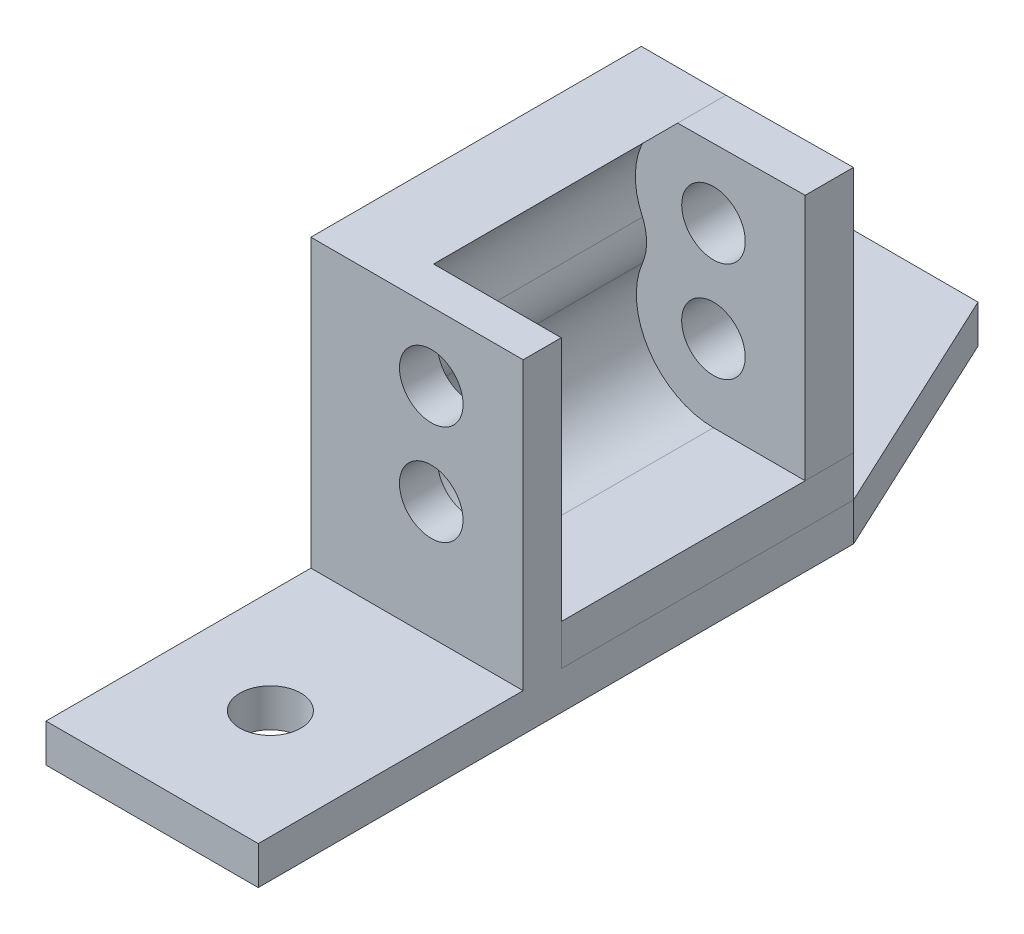
ISO-10303-21;
HEADER;
FILE_DESCRIPTION(('STEP AP214'),'2;1');
FILE_NAME('part.step','',(''),(''),'','','');
FILE_SCHEMA(('AUTOMOTIVE_DESIGN { 1 0 10303 214 1 1 1 1 }'));
ENDSEC;
DATA;
#1=APPLICATION_CONTEXT('core data for automotive mechanical design processes');
#2=APPLICATION_PROTOCOL_DEFINITION('international standard','automotive_design',2000,#1);
#3=PRODUCT_CONTEXT('',#1,'mechanical');
#4=PRODUCT('Part','Part','',(#3));
#5=PRODUCT_RELATED_PRODUCT_CATEGORY('part','',(#4));
#6=PRODUCT_DEFINITION_FORMATION('','',#4);
#7=PRODUCT_DEFINITION_CONTEXT('part definition',#1,'design');
#8=PRODUCT_DEFINITION('design','',#6,#7);
#9=PRODUCT_DEFINITION_SHAPE('','',#8);
#10=(LENGTH_UNIT() NAMED_UNIT(*) SI_UNIT(.MILLI.,.METRE.));
#11=(NAMED_UNIT(*) PLANE_ANGLE_UNIT() SI_UNIT($,.RADIAN.));
#12=(NAMED_UNIT(*) SI_UNIT($,.STERADIAN.) SOLID_ANGLE_UNIT());
#13=UNCERTAINTY_MEASURE_WITH_UNIT(LENGTH_MEASURE(1.E-05),#10,'distance_accuracy_value','');
#14=(GEOMETRIC_REPRESENTATION_CONTEXT(3) GLOBAL_UNCERTAINTY_ASSIGNED_CONTEXT((#13)) GLOBAL_UNIT_ASSIGNED_CONTEXT((#10,
#11,#12)) REPRESENTATION_CONTEXT('',''));
#15=CARTESIAN_POINT('',(0.,0.,0.));
#16=DIRECTION('',(0.,0.,1.));
#17=DIRECTION('',(1.,0.,0.));
#18=AXIS2_PLACEMENT_3D('',#15,#16,#17);
#19=CARTESIAN_POINT('',(103.654945314713,124.177430344163,-29.21));
#20=DIRECTION('',(0.,0.,1.));
#21=DIRECTION('',(1.,0.,0.));
#22=AXIS2_PLACEMENT_3D('',#19,#20,#21);
#23=CYLINDRICAL_SURFACE('',#22,7.41206888535351);
#24=DIRECTION('',(0.,0.,1.));
#25=VECTOR('',#24,1.);
#26=CARTESIAN_POINT('',(96.9626522694184,120.991213314968,-29.21));
#27=LINE('',#26,#25);
#28=CARTESIAN_POINT('',(96.9626522694184,120.991213314968,-24.384));
#29=VERTEX_POINT('',#28);
#30=CARTESIAN_POINT('',(96.9626522694184,120.991213314968,0.));
#31=VERTEX_POINT('',#30);
#32=EDGE_CURVE('E11',#29,#31,#27,.T.);
#33=ORIENTED_EDGE('',*,*,#32,.F.);
#34=CARTESIAN_POINT('',(103.654945314713,124.177430344163,-24.384));
#35=DIRECTION('',(0.,0.,-1.));
#36=DIRECTION('',(1.,0.,0.));
#37=AXIS2_PLACEMENT_3D('',#34,#35,#36);
#38=CIRCLE('',#37,7.41206888535352);
#39=CARTESIAN_POINT('',(100.468728285518,130.869723389457,-24.384));
#40=VERTEX_POINT('',#39);
#41=EDGE_CURVE('E246',#29,#40,#38,.T.);
#42=ORIENTED_EDGE('',*,*,#41,.T.);
#43=DIRECTION('',(0.,0.,1.));
#44=VECTOR('',#43,1.);
#45=CARTESIAN_POINT('',(100.468728285518,130.869723389457,-29.21));
#46=LINE('',#45,#44);
#47=CARTESIAN_POINT('',(100.468728285518,130.869723389457,0.));
#48=VERTEX_POINT('',#47);
#49=EDGE_CURVE('E301',#40,#48,#46,.T.);
#50=ORIENTED_EDGE('',*,*,#49,.T.);
#51=CARTESIAN_POINT('',(103.654945314713,124.177430344163,0.));
#52=DIRECTION('',(0.,0.,1.));
#53=DIRECTION('',(1.,0.,0.));
#54=AXIS2_PLACEMENT_3D('',#51,#52,#53);
#55=CIRCLE('',#54,7.41206888535351);
#56=EDGE_CURVE('E289',#48,#31,#55,.T.);
#57=ORIENTED_EDGE('',*,*,#56,.T.);
#58=EDGE_LOOP('',(#33,#42,#50,#57));
#59=FACE_BOUND('',#58,.T.);
#60=ADVANCED_FACE('F47',(#59),#23,.F.);
#61=CARTESIAN_POINT('',(92.2865318082464,119.006195070062,-29.21));
#62=DIRECTION('',(0.,0.,1.));
#63=DIRECTION('',(1.,0.,0.));
#64=AXIS2_PLACEMENT_3D('',#61,#62,#63);
#65=CYLINDRICAL_SURFACE('',#64,5.0800000000001);
#66=CARTESIAN_POINT('',(92.2865318082464,119.006195070062,-24.384));
#67=DIRECTION('',(0.,0.,1.));
#68=DIRECTION('',(-1.,0.,0.));
#69=AXIS2_PLACEMENT_3D('',#66,#67,#68);
#70=CIRCLE('',#69,5.08000000000009);
#71=CARTESIAN_POINT('',(96.960558708895,117.016252223643,-24.384));
#72=VERTEX_POINT('',#71);
#73=EDGE_CURVE('E62',#72,#29,#70,.T.);
#74=ORIENTED_EDGE('',*,*,#73,.T.);
#75=ORIENTED_EDGE('',*,*,#32,.T.);
#76=CARTESIAN_POINT('',(92.2865318082464,119.006195070062,0.));
#77=DIRECTION('',(0.,0.,1.));
#78=DIRECTION('',(1.,0.,0.));
#79=AXIS2_PLACEMENT_3D('',#76,#77,#78);
#80=CIRCLE('',#79,5.0800000000001);
#81=CARTESIAN_POINT('',(96.960558708895,117.016252223643,0.));
#82=VERTEX_POINT('',#81);
#83=EDGE_CURVE('E294',#82,#31,#80,.T.);
#84=ORIENTED_EDGE('',*,*,#83,.F.);
#85=DIRECTION('',(0.,0.,1.));
#86=VECTOR('',#85,1.);
#87=CARTESIAN_POINT('',(96.960558708895,117.016252223643,-29.21));
#88=LINE('',#87,#86);
#89=EDGE_CURVE('E55',#72,#82,#88,.T.);
#90=ORIENTED_EDGE('',*,*,#89,.F.);
#91=EDGE_LOOP('',(#74,#75,#84,#90));
#92=FACE_BOUND('',#91,.T.);
#93=ADVANCED_FACE('F356',(#92),#65,.T.);
#94=CARTESIAN_POINT('',(104.045206420171,113.999999999999,-29.21));
#95=DIRECTION('',(0.,0.,1.));
#96=DIRECTION('',(1.,0.,0.));
#97=AXIS2_PLACEMENT_3D('',#94,#95,#96);
#98=CYLINDRICAL_SURFACE('',#97,7.70000069282641);
#99=CARTESIAN_POINT('',(104.045206420171,113.999999999999,-24.384));
#100=DIRECTION('',(0.,0.,-1.));
#101=DIRECTION('',(1.,0.,0.));
#102=AXIS2_PLACEMENT_3D('',#99,#100,#101);
#103=CIRCLE('',#102,7.70000069282641);
#104=CARTESIAN_POINT('',(104.041152893911,106.300000374126,-24.384));
#105=VERTEX_POINT('',#104);
#106=EDGE_CURVE('E70',#105,#72,#103,.T.);
#107=ORIENTED_EDGE('',*,*,#106,.T.);
#108=ORIENTED_EDGE('',*,*,#89,.T.);
#109=CARTESIAN_POINT('',(104.045206420171,113.999999999999,0.));
#110=DIRECTION('',(0.,0.,1.));
#111=DIRECTION('',(1.,0.,0.));
#112=AXIS2_PLACEMENT_3D('',#109,#110,#111);
#113=CIRCLE('',#112,7.70000069282641);
#114=CARTESIAN_POINT('',(104.041152893911,106.300000374126,0.));
#115=VERTEX_POINT('',#114);
#116=EDGE_CURVE('E310',#115,#82,#113,.F.);
#117=ORIENTED_EDGE('',*,*,#116,.F.);
#118=DIRECTION('',(0.,0.,1.));
#119=VECTOR('',#118,1.);
#120=CARTESIAN_POINT('',(104.041152893911,106.300000374126,-29.21));
#121=LINE('',#120,#119);
#122=EDGE_CURVE('E316',#105,#115,#121,.T.);
#123=ORIENTED_EDGE('',*,*,#122,.F.);
#124=EDGE_LOOP('',(#107,#108,#117,#123));
#125=FACE_BOUND('',#124,.T.);
#126=ADVANCED_FACE('F355',(#125),#98,.F.);
#127=CARTESIAN_POINT('',(0.0559885400642075,106.35474149294,-29.21));
#128=DIRECTION('',(-0.000526431934488368,-0.9999998614347,0.));
#129=DIRECTION('',(0.9999998614347,-0.000526431934488368,0.));
#130=AXIS2_PLACEMENT_3D('',#127,#128,#129);
#131=PLANE('',#130);
#132=DIRECTION('',(0.,0.,1.));
#133=VECTOR('',#132,1.);
#134=CARTESIAN_POINT('',(113.21029867799,106.295173442304,-29.21));
#135=LINE('',#134,#133);
#136=CARTESIAN_POINT('',(113.21029867799,106.295173442304,-24.384));
#137=VERTEX_POINT('',#136);
#138=CARTESIAN_POINT('',(113.21029867799,106.295173442304,0.));
#139=VERTEX_POINT('',#138);
#140=EDGE_CURVE('E321',#137,#139,#135,.T.);
#141=ORIENTED_EDGE('',*,*,#140,.F.);
#142=DIRECTION('',(-0.9999998614347,0.000526431934489882,0.));
#143=VECTOR('',#142,1.);
#144=CARTESIAN_POINT('',(104.041152893911,106.300000374126,-24.384));
#145=LINE('',#144,#143);
#146=EDGE_CURVE('E241',#137,#105,#145,.T.);
#147=ORIENTED_EDGE('',*,*,#146,.T.);
#148=ORIENTED_EDGE('',*,*,#122,.T.);
#149=DIRECTION('',(0.9999998614347,-0.000526431934488368,0.));
#150=VECTOR('',#149,1.);
#151=CARTESIAN_POINT('',(0.0559885400642075,106.35474149294,0.));
#152=LINE('',#151,#150);
#153=EDGE_CURVE('E307',#115,#139,#152,.T.);
#154=ORIENTED_EDGE('',*,*,#153,.T.);
#155=EDGE_LOOP('',(#141,#147,#148,#154));
#156=FACE_BOUND('',#155,.T.);
#157=ADVANCED_FACE('F353',(#156),#131,.F.);
#158=CARTESIAN_POINT('',(113.59123961095,0.408659717572379,-29.21));
#159=DIRECTION('',(0.999993528577245,0.00359761082247394,0.));
#160=DIRECTION('',(-0.00359761082247394,0.999993528577246,0.));
#161=AXIS2_PLACEMENT_3D('',#158,#159,#160);
#162=PLANE('',#161);
#163=DIRECTION('',(-0.00359761082247394,0.999993528577245,0.));
#164=VECTOR('',#163,1.);
#165=CARTESIAN_POINT('',(113.59123961095,0.408659717572379,0.));
#166=LINE('',#165,#164);
#167=CARTESIAN_POINT('',(113.224902097455,102.236000374126,0.));
#168=VERTEX_POINT('',#167);
#169=EDGE_CURVE('E304',#168,#139,#166,.T.);
#170=ORIENTED_EDGE('',*,*,#169,.F.);
#171=DIRECTION('',(0.,0.,1.));
#172=VECTOR('',#171,1.);
#173=CARTESIAN_POINT('',(113.224902097455,102.236000374126,-29.21));
#174=LINE('',#173,#172);
#175=CARTESIAN_POINT('',(113.224902097455,102.236000374126,-29.21));
#176=VERTEX_POINT('',#175);
#177=EDGE_CURVE('E322',#176,#168,#174,.T.);
#178=ORIENTED_EDGE('',*,*,#177,.F.);
#179=DIRECTION('',(-0.00359761082247394,0.999993528577245,0.));
#180=VECTOR('',#179,1.);
#181=CARTESIAN_POINT('',(113.59123961095,0.408659717572379,-29.21));
#182=LINE('',#181,#180);
#183=CARTESIAN_POINT('',(113.21029867799,106.295173442304,-29.21));
#184=VERTEX_POINT('',#183);
#185=EDGE_CURVE('E299',#176,#184,#182,.T.);
#186=ORIENTED_EDGE('',*,*,#185,.T.);
#187=EDGE_CURVE('E318',#184,#137,#135,.T.);
#188=ORIENTED_EDGE('',*,*,#187,.T.);
#189=ORIENTED_EDGE('',*,*,#140,.T.);
#190=EDGE_LOOP('',(#170,#178,#186,#188,#189));
#191=FACE_BOUND('',#190,.T.);
#192=ADVANCED_FACE('F349',(#191),#162,.T.);
#193=CARTESIAN_POINT('',(92.0179779446539,0.,-29.21));
#194=DIRECTION('',(-1.,0.,0.));
#195=DIRECTION('',(0.,0.,1.));
#196=AXIS2_PLACEMENT_3D('',#193,#194,#195);
#197=PLANE('',#196);
#198=DIRECTION('',(0.,-1.,0.));
#199=VECTOR('',#198,1.);
#200=CARTESIAN_POINT('',(92.0179779446539,0.,-29.21));
#201=LINE('',#200,#199);
#202=CARTESIAN_POINT('',(92.0179779446539,130.869723389457,-29.21));
#203=VERTEX_POINT('',#202);
#204=CARTESIAN_POINT('',(92.0179779446539,102.236000374126,-29.21));
#205=VERTEX_POINT('',#204);
#206=EDGE_CURVE('E293',#203,#205,#201,.T.);
#207=ORIENTED_EDGE('',*,*,#206,.T.);
#208=DIRECTION('',(0.,1.,0.));
#209=VECTOR('',#208,1.);
#210=CARTESIAN_POINT('',(92.0179779446539,98.4260003741257,-29.21));
#211=LINE('',#210,#209);
#212=CARTESIAN_POINT('',(92.0179779446539,98.4260003741257,-29.21));
#213=VERTEX_POINT('',#212);
#214=EDGE_CURVE('E172',#213,#205,#211,.T.);
#215=ORIENTED_EDGE('',*,*,#214,.F.);
#216=DIRECTION('',(0.,0.,1.));
#217=VECTOR('',#216,1.);
#218=CARTESIAN_POINT('',(92.0179779446539,98.4260003741257,-29.21));
#219=LINE('',#218,#217);
#220=CARTESIAN_POINT('',(92.0179779446539,98.4260003741257,30.2731574693667));
#221=VERTEX_POINT('',#220);
#222=EDGE_CURVE('E164',#213,#221,#219,.T.);
#223=ORIENTED_EDGE('',*,*,#222,.T.);
#224=DIRECTION('',(0.,1.,0.));
#225=VECTOR('',#224,1.);
#226=CARTESIAN_POINT('',(92.0179779446539,98.4260003741257,30.2731574693667));
#227=LINE('',#226,#225);
#228=CARTESIAN_POINT('',(92.0179779446539,102.236000374126,30.2731574693667));
#229=VERTEX_POINT('',#228);
#230=EDGE_CURVE('E169',#221,#229,#227,.T.);
#231=ORIENTED_EDGE('',*,*,#230,.T.);
#232=DIRECTION('',(0.,0.,1.));
#233=VECTOR('',#232,1.);
#234=CARTESIAN_POINT('',(92.0179779446539,102.236000374126,3.81));
#235=LINE('',#234,#233);
#236=CARTESIAN_POINT('',(92.0179779446539,102.236000374126,3.81));
#237=VERTEX_POINT('',#236);
#238=EDGE_CURVE('E204',#237,#229,#235,.T.);
#239=ORIENTED_EDGE('',*,*,#238,.F.);
#240=DIRECTION('',(0.,-1.,0.));
#241=VECTOR('',#240,1.);
#242=CARTESIAN_POINT('',(92.0179779446539,130.869723389457,3.81));
#243=LINE('',#242,#241);
#244=CARTESIAN_POINT('',(92.0179779446539,130.869723389457,3.81));
#245=VERTEX_POINT('',#244);
#246=EDGE_CURVE('E276',#245,#237,#243,.T.);
#247=ORIENTED_EDGE('',*,*,#246,.F.);
#248=DIRECTION('',(0.,0.,1.));
#249=VECTOR('',#248,1.);
#250=CARTESIAN_POINT('',(92.0179779446539,130.869723389457,-29.21));
#251=LINE('',#250,#249);
#252=EDGE_CURVE('E324',#203,#245,#251,.T.);
#253=ORIENTED_EDGE('',*,*,#252,.F.);
#254=EDGE_LOOP('',(#207,#215,#223,#231,#239,#247,#253));
#255=FACE_BOUND('',#254,.T.);
#256=ADVANCED_FACE('F167',(#255),#197,.T.);
#257=CARTESIAN_POINT('',(0.,130.869723389457,-29.21));
#258=DIRECTION('',(0.,1.,0.));
#259=DIRECTION('',(0.,0.,1.));
#260=AXIS2_PLACEMENT_3D('',#257,#258,#259);
#261=PLANE('',#260);
#262=ORIENTED_EDGE('',*,*,#252,.T.);
#263=DIRECTION('',(-1.,0.,0.));
#264=VECTOR('',#263,1.);
#265=CARTESIAN_POINT('',(92.0179779446539,130.869723389457,3.81));
#266=LINE('',#265,#264);
#267=CARTESIAN_POINT('',(113.224902097455,130.869723389457,3.81));
#268=VERTEX_POINT('',#267);
#269=EDGE_CURVE('E273',#268,#245,#266,.T.);
#270=ORIENTED_EDGE('',*,*,#269,.F.);
#271=DIRECTION('',(0.,0.,-1.));
#272=VECTOR('',#271,1.);
#273=CARTESIAN_POINT('',(113.224902097455,130.869723389457,3.81));
#274=LINE('',#273,#272);
#275=CARTESIAN_POINT('',(113.224902097455,130.869723389457,0.));
#276=VERTEX_POINT('',#275);
#277=EDGE_CURVE('E283',#268,#276,#274,.T.);
#278=ORIENTED_EDGE('',*,*,#277,.T.);
#279=DIRECTION('',(-1.,0.,0.));
#280=VECTOR('',#279,1.);
#281=CARTESIAN_POINT('',(92.0179779446539,130.869723389457,0.));
#282=LINE('',#281,#280);
#283=EDGE_CURVE('E270',#276,#48,#282,.T.);
#284=ORIENTED_EDGE('',*,*,#283,.T.);
#285=ORIENTED_EDGE('',*,*,#49,.F.);
#286=CARTESIAN_POINT('',(100.468728285518,130.869723389457,-29.21));
#287=VERTEX_POINT('',#286);
#288=EDGE_CURVE('E50',#287,#40,#46,.T.);
#289=ORIENTED_EDGE('',*,*,#288,.F.);
#290=DIRECTION('',(-1.,0.,0.));
#291=VECTOR('',#290,1.);
#292=CARTESIAN_POINT('',(0.,130.869723389457,-29.21));
#293=LINE('',#292,#291);
#294=EDGE_CURVE('E290',#287,#203,#293,.T.);
#295=ORIENTED_EDGE('',*,*,#294,.T.);
#296=EDGE_LOOP('',(#262,#270,#278,#284,#285,#289,#295));
#297=FACE_BOUND('',#296,.T.);
#298=ADVANCED_FACE('F341',(#297),#261,.T.);
#299=CARTESIAN_POINT('',(0.,0.,-29.21));
#300=DIRECTION('',(0.,0.,1.));
#301=DIRECTION('',(1.,0.,0.));
#302=AXIS2_PLACEMENT_3D('',#299,#300,#301);
#303=PLANE('',#302);
#304=DIRECTION('',(0.,-1.,0.));
#305=VECTOR('',#304,1.);
#306=CARTESIAN_POINT('',(113.21029867799,106.295173442304,-29.21));
#307=LINE('',#306,#305);
#308=CARTESIAN_POINT('',(113.21029867799,130.994991710537,-29.21));
#309=VERTEX_POINT('',#308);
#310=EDGE_CURVE('E243',#309,#184,#307,.T.);
#311=ORIENTED_EDGE('',*,*,#310,.T.);
#312=ORIENTED_EDGE('',*,*,#185,.F.);
#313=DIRECTION('',(1.,0.,0.));
#314=VECTOR('',#313,1.);
#315=CARTESIAN_POINT('',(0.,102.236000374126,-29.21));
#316=LINE('',#315,#314);
#317=EDGE_CURVE('E296',#205,#176,#316,.T.);
#318=ORIENTED_EDGE('',*,*,#317,.F.);
#319=ORIENTED_EDGE('',*,*,#206,.F.);
#320=ORIENTED_EDGE('',*,*,#294,.F.);
#321=DIRECTION('',(0.99995167463754,0.00983099128164452,0.));
#322=VECTOR('',#321,1.);
#323=CARTESIAN_POINT('',(113.21029867799,130.994991710537,-29.21));
#324=LINE('',#323,#322);
#325=EDGE_CURVE('E238',#287,#309,#324,.T.);
#326=ORIENTED_EDGE('',*,*,#325,.T.);
#327=EDGE_LOOP('',(#311,#312,#318,#319,#320,#326));
#328=FACE_BOUND('',#327,.T.);
#329=CARTESIAN_POINT('',(104.050470740246,123.999999999999,-29.21));
#330=DIRECTION('',(0.,0.,-1.));
#331=DIRECTION('',(-1.,0.,0.));
#332=AXIS2_PLACEMENT_3D('',#329,#330,#331);
#333=CIRCLE('',#332,3.17499999999997);
#334=CARTESIAN_POINT('',(100.875470740246,123.999999999999,-29.21));
#335=VERTEX_POINT('',#334);
#336=EDGE_CURVE('E220',#335,#335,#333,.T.);
#337=ORIENTED_EDGE('',*,*,#336,.F.);
#338=EDGE_LOOP('',(#337));
#339=FACE_BOUND('',#338,.T.);
#340=CARTESIAN_POINT('',(104.045206420171,113.999999999999,-29.21));
#341=DIRECTION('',(0.,0.,-1.));
#342=DIRECTION('',(-1.,0.,0.));
#343=AXIS2_PLACEMENT_3D('',#340,#341,#342);
#344=CIRCLE('',#343,3.17499999999994);
#345=CARTESIAN_POINT('',(100.870206420171,113.999999999999,-29.21));
#346=VERTEX_POINT('',#345);
#347=EDGE_CURVE('E232',#346,#346,#344,.T.);
#348=ORIENTED_EDGE('',*,*,#347,.F.);
#349=EDGE_LOOP('',(#348));
#350=FACE_BOUND('',#349,.T.);
#351=ADVANCED_FACE('F365',(#328,#339,#350),#303,.F.);
#352=CARTESIAN_POINT('',(0.,0.,0.));
#353=DIRECTION('',(0.,0.,-1.));
#354=DIRECTION('',(-1.,0.,0.));
#355=AXIS2_PLACEMENT_3D('',#352,#353,#354);
#356=PLANE('',#355);
#357=CARTESIAN_POINT('',(104.045206420171,113.999999999999,0.));
#358=DIRECTION('',(0.,0.,1.));
#359=DIRECTION('',(1.,0.,0.));
#360=AXIS2_PLACEMENT_3D('',#357,#358,#359);
#361=CIRCLE('',#360,3.17500000000001);
#362=CARTESIAN_POINT('',(100.870206420171,113.999999999999,0.));
#363=VERTEX_POINT('',#362);
#364=EDGE_CURVE('E260',#363,#363,#361,.T.);
#365=ORIENTED_EDGE('',*,*,#364,.T.);
#366=EDGE_LOOP('',(#365));
#367=FACE_BOUND('',#366,.T.);
#368=CARTESIAN_POINT('',(104.050470740245,123.999999999999,0.));
#369=DIRECTION('',(0.,0.,1.));
#370=DIRECTION('',(1.,0.,0.));
#371=AXIS2_PLACEMENT_3D('',#368,#369,#370);
#372=CIRCLE('',#371,3.17500000000003);
#373=CARTESIAN_POINT('',(100.875470740245,123.999999999999,0.));
#374=VERTEX_POINT('',#373);
#375=EDGE_CURVE('E264',#374,#374,#372,.T.);
#376=ORIENTED_EDGE('',*,*,#375,.T.);
#377=EDGE_LOOP('',(#376));
#378=FACE_BOUND('',#377,.T.);
#379=ORIENTED_EDGE('',*,*,#56,.F.);
#380=ORIENTED_EDGE('',*,*,#283,.F.);
#381=DIRECTION('',(0.,1.,0.));
#382=VECTOR('',#381,1.);
#383=CARTESIAN_POINT('',(113.224902097455,130.869723389457,0.));
#384=LINE('',#383,#382);
#385=EDGE_CURVE('E277',#168,#276,#384,.T.);
#386=ORIENTED_EDGE('',*,*,#385,.F.);
#387=ORIENTED_EDGE('',*,*,#169,.T.);
#388=ORIENTED_EDGE('',*,*,#153,.F.);
#389=ORIENTED_EDGE('',*,*,#116,.T.);
#390=ORIENTED_EDGE('',*,*,#83,.T.);
#391=EDGE_LOOP('',(#379,#380,#386,#387,#388,#389,#390));
#392=FACE_BOUND('',#391,.T.);
#393=ADVANCED_FACE('F338',(#367,#378,#392),#356,.T.);
#394=CARTESIAN_POINT('',(0.,0.,3.81));
#395=DIRECTION('',(0.,0.,-1.));
#396=DIRECTION('',(-1.,0.,0.));
#397=AXIS2_PLACEMENT_3D('',#394,#395,#396);
#398=PLANE('',#397);
#399=ORIENTED_EDGE('',*,*,#269,.T.);
#400=ORIENTED_EDGE('',*,*,#246,.T.);
#401=DIRECTION('',(1.,0.,0.));
#402=VECTOR('',#401,1.);
#403=CARTESIAN_POINT('',(92.0179779446539,102.236000374126,3.81));
#404=LINE('',#403,#402);
#405=CARTESIAN_POINT('',(113.224902097455,102.236000374126,3.81));
#406=VERTEX_POINT('',#405);
#407=EDGE_CURVE('E279',#237,#406,#404,.T.);
#408=ORIENTED_EDGE('',*,*,#407,.T.);
#409=DIRECTION('',(0.,1.,0.));
#410=VECTOR('',#409,1.);
#411=CARTESIAN_POINT('',(113.224902097455,130.869723389457,3.81));
#412=LINE('',#411,#410);
#413=EDGE_CURVE('E281',#406,#268,#412,.T.);
#414=ORIENTED_EDGE('',*,*,#413,.T.);
#415=EDGE_LOOP('',(#399,#400,#408,#414));
#416=FACE_BOUND('',#415,.T.);
#417=CARTESIAN_POINT('',(104.050470740245,123.999999999999,3.81));
#418=DIRECTION('',(0.,0.,1.));
#419=DIRECTION('',(1.,0.,0.));
#420=AXIS2_PLACEMENT_3D('',#417,#418,#419);
#421=CIRCLE('',#420,3.17500000000003);
#422=CARTESIAN_POINT('',(100.875470740245,123.999999999999,3.81));
#423=VERTEX_POINT('',#422);
#424=EDGE_CURVE('E267',#423,#423,#421,.T.);
#425=ORIENTED_EDGE('',*,*,#424,.F.);
#426=EDGE_LOOP('',(#425));
#427=FACE_BOUND('',#426,.T.);
#428=CARTESIAN_POINT('',(104.045206420171,113.999999999999,3.81));
#429=DIRECTION('',(0.,0.,1.));
#430=DIRECTION('',(1.,0.,0.));
#431=AXIS2_PLACEMENT_3D('',#428,#429,#430);
#432=CIRCLE('',#431,3.17500000000001);
#433=CARTESIAN_POINT('',(100.870206420171,113.999999999999,3.81));
#434=VERTEX_POINT('',#433);
#435=EDGE_CURVE('E261',#434,#434,#432,.T.);
#436=ORIENTED_EDGE('',*,*,#435,.F.);
#437=EDGE_LOOP('',(#436));
#438=FACE_BOUND('',#437,.T.);
#439=ADVANCED_FACE('F405',(#416,#427,#438),#398,.F.);
#440=CARTESIAN_POINT('',(113.224902097455,130.869723389457,3.81));
#441=DIRECTION('',(-1.,0.,0.));
#442=DIRECTION('',(0.,0.,1.));
#443=AXIS2_PLACEMENT_3D('',#440,#441,#442);
#444=PLANE('',#443);
#445=ORIENTED_EDGE('',*,*,#385,.T.);
#446=ORIENTED_EDGE('',*,*,#277,.F.);
#447=ORIENTED_EDGE('',*,*,#413,.F.);
#448=DIRECTION('',(0.,0.,-1.));
#449=VECTOR('',#448,1.);
#450=CARTESIAN_POINT('',(113.224902097455,102.236000374126,-29.21));
#451=LINE('',#450,#449);
#452=CARTESIAN_POINT('',(113.224902097455,102.236000374126,30.2731574693667));
#453=VERTEX_POINT('',#452);
#454=EDGE_CURVE('E208',#453,#406,#451,.T.);
#455=ORIENTED_EDGE('',*,*,#454,.F.);
#456=DIRECTION('',(0.,1.,0.));
#457=VECTOR('',#456,1.);
#458=CARTESIAN_POINT('',(113.224902097455,98.4260003741257,30.2731574693667));
#459=LINE('',#458,#457);
#460=CARTESIAN_POINT('',(113.224902097455,98.4260003741257,30.2731574693667));
#461=VERTEX_POINT('',#460);
#462=EDGE_CURVE('E186',#461,#453,#459,.T.);
#463=ORIENTED_EDGE('',*,*,#462,.F.);
#464=DIRECTION('',(0.,0.,-1.));
#465=VECTOR('',#464,1.);
#466=CARTESIAN_POINT('',(113.224902097455,98.4260003741257,3.81));
#467=LINE('',#466,#465);
#468=CARTESIAN_POINT('',(113.224902097455,98.4260003741257,-29.21));
#469=VERTEX_POINT('',#468);
#470=EDGE_CURVE('E192',#461,#469,#467,.T.);
#471=ORIENTED_EDGE('',*,*,#470,.T.);
#472=DIRECTION('',(0.,1.,0.));
#473=VECTOR('',#472,1.);
#474=CARTESIAN_POINT('',(113.224902097455,98.4260003741257,-29.21));
#475=LINE('',#474,#473);
#476=EDGE_CURVE('E225',#469,#176,#475,.T.);
#477=ORIENTED_EDGE('',*,*,#476,.T.);
#478=ORIENTED_EDGE('',*,*,#177,.T.);
#479=EDGE_LOOP('',(#445,#446,#447,#455,#463,#471,#477,#478));
#480=FACE_BOUND('',#479,.T.);
#481=ADVANCED_FACE('F345',(#480),#444,.F.);
#482=CARTESIAN_POINT('',(104.050470740245,123.999999999999,3.81));
#483=DIRECTION('',(0.,0.,-1.));
#484=DIRECTION('',(-1.,0.,0.));
#485=AXIS2_PLACEMENT_3D('',#482,#483,#484);
#486=CYLINDRICAL_SURFACE('',#485,3.17500000000003);
#487=CARTESIAN_POINT('',(100.875470740245,123.999999999999,3.81));
#488=CARTESIAN_POINT('',(100.875470740245,123.999999999999,3.7703125));
#489=CARTESIAN_POINT('',(100.875470740245,123.999999999999,3.730625));
#490=CARTESIAN_POINT('',(100.875470740245,123.999999999999,3.65125));
#491=CARTESIAN_POINT('',(100.875470740245,123.999999999999,3.6115625));
#492=CARTESIAN_POINT('',(100.875470740245,123.999999999999,3.5321875));
#493=CARTESIAN_POINT('',(100.875470740245,123.999999999999,3.4925));
#494=CARTESIAN_POINT('',(100.875470740245,123.999999999999,3.413125));
#495=CARTESIAN_POINT('',(100.875470740245,123.999999999999,3.3734375));
#496=CARTESIAN_POINT('',(100.875470740245,123.999999999999,3.2940625));
#497=CARTESIAN_POINT('',(100.875470740245,123.999999999999,3.254375));
#498=CARTESIAN_POINT('',(100.875470740245,123.999999999999,3.175));
#499=CARTESIAN_POINT('',(100.875470740245,123.999999999999,3.1353125));
#500=CARTESIAN_POINT('',(100.875470740245,123.999999999999,3.0559375));
#501=CARTESIAN_POINT('',(100.875470740245,123.999999999999,3.01625));
#502=CARTESIAN_POINT('',(100.875470740245,123.999999999999,2.936875));
#503=CARTESIAN_POINT('',(100.875470740245,123.999999999999,2.8971875));
#504=CARTESIAN_POINT('',(100.875470740245,123.999999999999,2.8178125));
#505=CARTESIAN_POINT('',(100.875470740245,123.999999999999,2.778125));
#506=CARTESIAN_POINT('',(100.875470740245,123.999999999999,2.69875));
#507=CARTESIAN_POINT('',(100.875470740245,123.999999999999,2.6590625));
#508=CARTESIAN_POINT('',(100.875470740245,123.999999999999,2.5796875));
#509=CARTESIAN_POINT('',(100.875470740245,123.999999999999,2.54));
#510=CARTESIAN_POINT('',(100.875470740245,123.999999999999,2.460625));
#511=CARTESIAN_POINT('',(100.875470740245,123.999999999999,2.4209375));
#512=CARTESIAN_POINT('',(100.875470740245,123.999999999999,2.3415625));
#513=CARTESIAN_POINT('',(100.875470740245,123.999999999999,2.301875));
#514=CARTESIAN_POINT('',(100.875470740245,123.999999999999,2.2225));
#515=CARTESIAN_POINT('',(100.875470740245,123.999999999999,2.1828125));
#516=CARTESIAN_POINT('',(100.875470740245,123.999999999999,2.1034375));
#517=CARTESIAN_POINT('',(100.875470740245,123.999999999999,2.06375));
#518=CARTESIAN_POINT('',(100.875470740245,123.999999999999,1.984375));
#519=CARTESIAN_POINT('',(100.875470740245,123.999999999999,1.9446875));
#520=CARTESIAN_POINT('',(100.875470740245,123.999999999999,1.8653125));
#521=CARTESIAN_POINT('',(100.875470740245,123.999999999999,1.825625));
#522=CARTESIAN_POINT('',(100.875470740245,123.999999999999,1.74625));
#523=CARTESIAN_POINT('',(100.875470740245,123.999999999999,1.7065625));
#524=CARTESIAN_POINT('',(100.875470740245,123.999999999999,1.6271875));
#525=CARTESIAN_POINT('',(100.875470740245,123.999999999999,1.5875));
#526=CARTESIAN_POINT('',(100.875470740245,123.999999999999,1.508125));
#527=CARTESIAN_POINT('',(100.875470740245,123.999999999999,1.4684375));
#528=CARTESIAN_POINT('',(100.875470740245,123.999999999999,1.3890625));
#529=CARTESIAN_POINT('',(100.875470740245,123.999999999999,1.349375));
#530=CARTESIAN_POINT('',(100.875470740245,123.999999999999,1.27));
#531=CARTESIAN_POINT('',(100.875470740245,123.999999999999,1.2303125));
#532=CARTESIAN_POINT('',(100.875470740245,123.999999999999,1.1509375));
#533=CARTESIAN_POINT('',(100.875470740245,123.999999999999,1.11125));
#534=CARTESIAN_POINT('',(100.875470740245,123.999999999999,1.031875));
#535=CARTESIAN_POINT('',(100.875470740245,123.999999999999,0.9921875));
#536=CARTESIAN_POINT('',(100.875470740245,123.999999999999,0.9128125));
#537=CARTESIAN_POINT('',(100.875470740245,123.999999999999,0.873125));
#538=CARTESIAN_POINT('',(100.875470740245,123.999999999999,0.79375));
#539=CARTESIAN_POINT('',(100.875470740245,123.999999999999,0.7540625));
#540=CARTESIAN_POINT('',(100.875470740245,123.999999999999,0.6746875));
#541=CARTESIAN_POINT('',(100.875470740245,123.999999999999,0.635));
#542=CARTESIAN_POINT('',(100.875470740245,123.999999999999,0.555625));
#543=CARTESIAN_POINT('',(100.875470740245,123.999999999999,0.5159375));
#544=CARTESIAN_POINT('',(100.875470740245,123.999999999999,0.4365625));
#545=CARTESIAN_POINT('',(100.875470740245,123.999999999999,0.396875));
#546=CARTESIAN_POINT('',(100.875470740245,123.999999999999,0.3175));
#547=CARTESIAN_POINT('',(100.875470740245,123.999999999999,0.2778125));
#548=CARTESIAN_POINT('',(100.875470740245,123.999999999999,0.1984375));
#549=CARTESIAN_POINT('',(100.875470740245,123.999999999999,0.15875));
#550=CARTESIAN_POINT('',(100.875470740245,123.999999999999,0.0793749999999999));
#551=CARTESIAN_POINT('',(100.875470740245,123.999999999999,0.0396874999999999));
#552=CARTESIAN_POINT('',(100.875470740245,123.999999999999,0.));
#553=B_SPLINE_CURVE_WITH_KNOTS('',3,(#487,#488,#489,#490,#491,#492,#493,#494,#495,#496,#497,
#498,#499,#500,#501,#502,#503,#504,#505,#506,#507,#508,#509,#510,#511,#512,#513,#514,#515,#516,
#517,#518,#519,#520,#521,#522,#523,#524,#525,#526,#527,#528,#529,#530,#531,#532,#533,#534,#535,
#536,#537,#538,#539,#540,#541,#542,#543,#544,#545,#546,#547,#548,#549,#550,#551,#552),
.UNSPECIFIED.,.F.,.F.,(4,2,2,2,2,2,2,2,2,2,2,2,2,2,2,2,2,2,2,2,2,2,2,2,2,2,2,2,2,2,2,2,4),(0.,
0.1190625,0.238125,0.3571875,0.47625,0.595312499999999,0.714375,0.833437499999999,
0.952499999999999,1.0715625,1.190625,1.3096875,1.42875,1.5478125,1.666875,1.7859375,1.905,
2.0240625,2.143125,2.2621875,2.38125,2.5003125,2.619375,2.7384375,2.8575,2.9765625,3.095625,
3.2146875,3.33375,3.4528125,3.571875,3.6909375,3.81),.UNSPECIFIED.);
#554=EDGE_CURVE('BSEAM378',#423,#374,#553,.T.);
#555=ORIENTED_EDGE('',*,*,#424,.T.);
#556=ORIENTED_EDGE('',*,*,#375,.F.);
#557=ORIENTED_EDGE('',*,*,#554,.T.);
#558=ORIENTED_EDGE('',*,*,#554,.F.);
#559=EDGE_LOOP('',(#555,#557,#556,#558));
#560=FACE_BOUND('',#559,.T.);
#561=ADVANCED_FACE('F378',(#560),#486,.F.);
#562=CARTESIAN_POINT('',(104.045206420171,113.999999999999,3.81));
#563=DIRECTION('',(0.,0.,-1.));
#564=DIRECTION('',(-1.,0.,0.));
#565=AXIS2_PLACEMENT_3D('',#562,#563,#564);
#566=CYLINDRICAL_SURFACE('',#565,3.17500000000001);
#567=CARTESIAN_POINT('',(100.870206420171,113.999999999999,3.81));
#568=CARTESIAN_POINT('',(100.870206420171,113.999999999999,3.7703125));
#569=CARTESIAN_POINT('',(100.870206420171,113.999999999999,3.730625));
#570=CARTESIAN_POINT('',(100.870206420171,113.999999999999,3.65125));
#571=CARTESIAN_POINT('',(100.870206420171,113.999999999999,3.6115625));
#572=CARTESIAN_POINT('',(100.870206420171,113.999999999999,3.5321875));
#573=CARTESIAN_POINT('',(100.870206420171,113.999999999999,3.4925));
#574=CARTESIAN_POINT('',(100.870206420171,113.999999999999,3.413125));
#575=CARTESIAN_POINT('',(100.870206420171,113.999999999999,3.3734375));
#576=CARTESIAN_POINT('',(100.870206420171,113.999999999999,3.2940625));
#577=CARTESIAN_POINT('',(100.870206420171,113.999999999999,3.254375));
#578=CARTESIAN_POINT('',(100.870206420171,113.999999999999,3.175));
#579=CARTESIAN_POINT('',(100.870206420171,113.999999999999,3.1353125));
#580=CARTESIAN_POINT('',(100.870206420171,113.999999999999,3.0559375));
#581=CARTESIAN_POINT('',(100.870206420171,113.999999999999,3.01625));
#582=CARTESIAN_POINT('',(100.870206420171,113.999999999999,2.936875));
#583=CARTESIAN_POINT('',(100.870206420171,113.999999999999,2.8971875));
#584=CARTESIAN_POINT('',(100.870206420171,113.999999999999,2.8178125));
#585=CARTESIAN_POINT('',(100.870206420171,113.999999999999,2.778125));
#586=CARTESIAN_POINT('',(100.870206420171,113.999999999999,2.69875));
#587=CARTESIAN_POINT('',(100.870206420171,113.999999999999,2.6590625));
#588=CARTESIAN_POINT('',(100.870206420171,113.999999999999,2.5796875));
#589=CARTESIAN_POINT('',(100.870206420171,113.999999999999,2.54));
#590=CARTESIAN_POINT('',(100.870206420171,113.999999999999,2.460625));
#591=CARTESIAN_POINT('',(100.870206420171,113.999999999999,2.4209375));
#592=CARTESIAN_POINT('',(100.870206420171,113.999999999999,2.3415625));
#593=CARTESIAN_POINT('',(100.870206420171,113.999999999999,2.301875));
#594=CARTESIAN_POINT('',(100.870206420171,113.999999999999,2.2225));
#595=CARTESIAN_POINT('',(100.870206420171,113.999999999999,2.1828125));
#596=CARTESIAN_POINT('',(100.870206420171,113.999999999999,2.1034375));
#597=CARTESIAN_POINT('',(100.870206420171,113.999999999999,2.06375));
#598=CARTESIAN_POINT('',(100.870206420171,113.999999999999,1.984375));
#599=CARTESIAN_POINT('',(100.870206420171,113.999999999999,1.9446875));
#600=CARTESIAN_POINT('',(100.870206420171,113.999999999999,1.8653125));
#601=CARTESIAN_POINT('',(100.870206420171,113.999999999999,1.825625));
#602=CARTESIAN_POINT('',(100.870206420171,113.999999999999,1.74625));
#603=CARTESIAN_POINT('',(100.870206420171,113.999999999999,1.7065625));
#604=CARTESIAN_POINT('',(100.870206420171,113.999999999999,1.6271875));
#605=CARTESIAN_POINT('',(100.870206420171,113.999999999999,1.5875));
#606=CARTESIAN_POINT('',(100.870206420171,113.999999999999,1.508125));
#607=CARTESIAN_POINT('',(100.870206420171,113.999999999999,1.4684375));
#608=CARTESIAN_POINT('',(100.870206420171,113.999999999999,1.3890625));
#609=CARTESIAN_POINT('',(100.870206420171,113.999999999999,1.349375));
#610=CARTESIAN_POINT('',(100.870206420171,113.999999999999,1.27));
#611=CARTESIAN_POINT('',(100.870206420171,113.999999999999,1.2303125));
#612=CARTESIAN_POINT('',(100.870206420171,113.999999999999,1.1509375));
#613=CARTESIAN_POINT('',(100.870206420171,113.999999999999,1.11125));
#614=CARTESIAN_POINT('',(100.870206420171,113.999999999999,1.031875));
#615=CARTESIAN_POINT('',(100.870206420171,113.999999999999,0.9921875));
#616=CARTESIAN_POINT('',(100.870206420171,113.999999999999,0.9128125));
#617=CARTESIAN_POINT('',(100.870206420171,113.999999999999,0.873125));
#618=CARTESIAN_POINT('',(100.870206420171,113.999999999999,0.79375));
#619=CARTESIAN_POINT('',(100.870206420171,113.999999999999,0.7540625));
#620=CARTESIAN_POINT('',(100.870206420171,113.999999999999,0.6746875));
#621=CARTESIAN_POINT('',(100.870206420171,113.999999999999,0.635));
#622=CARTESIAN_POINT('',(100.870206420171,113.999999999999,0.555625));
#623=CARTESIAN_POINT('',(100.870206420171,113.999999999999,0.5159375));
#624=CARTESIAN_POINT('',(100.870206420171,113.999999999999,0.4365625));
#625=CARTESIAN_POINT('',(100.870206420171,113.999999999999,0.396875));
#626=CARTESIAN_POINT('',(100.870206420171,113.999999999999,0.3175));
#627=CARTESIAN_POINT('',(100.870206420171,113.999999999999,0.2778125));
#628=CARTESIAN_POINT('',(100.870206420171,113.999999999999,0.1984375));
#629=CARTESIAN_POINT('',(100.870206420171,113.999999999999,0.15875));
#630=CARTESIAN_POINT('',(100.870206420171,113.999999999999,0.0793749999999999));
#631=CARTESIAN_POINT('',(100.870206420171,113.999999999999,0.0396874999999999));
#632=CARTESIAN_POINT('',(100.870206420171,113.999999999999,0.));
#633=B_SPLINE_CURVE_WITH_KNOTS('',3,(#567,#568,#569,#570,#571,#572,#573,#574,#575,#576,#577,
#578,#579,#580,#581,#582,#583,#584,#585,#586,#587,#588,#589,#590,#591,#592,#593,#594,#595,#596,
#597,#598,#599,#600,#601,#602,#603,#604,#605,#606,#607,#608,#609,#610,#611,#612,#613,#614,#615,
#616,#617,#618,#619,#620,#621,#622,#623,#624,#625,#626,#627,#628,#629,#630,#631,#632),
.UNSPECIFIED.,.F.,.F.,(4,2,2,2,2,2,2,2,2,2,2,2,2,2,2,2,2,2,2,2,2,2,2,2,2,2,2,2,2,2,2,2,4),(0.,
0.1190625,0.238125,0.3571875,0.47625,0.595312499999999,0.714375,0.833437499999999,
0.952499999999999,1.0715625,1.190625,1.3096875,1.42875,1.5478125,1.666875,1.7859375,1.905,
2.0240625,2.143125,2.2621875,2.38125,2.5003125,2.619375,2.7384375,2.8575,2.9765625,3.095625,
3.2146875,3.33375,3.4528125,3.571875,3.6909375,3.81),.UNSPECIFIED.);
#634=EDGE_CURVE('BSEAM370',#434,#363,#633,.T.);
#635=ORIENTED_EDGE('',*,*,#435,.T.);
#636=ORIENTED_EDGE('',*,*,#364,.F.);
#637=ORIENTED_EDGE('',*,*,#634,.T.);
#638=ORIENTED_EDGE('',*,*,#634,.F.);
#639=EDGE_LOOP('',(#635,#637,#636,#638));
#640=FACE_BOUND('',#639,.T.);
#641=ADVANCED_FACE('F370',(#640),#566,.F.);
#642=CARTESIAN_POINT('',(113.21029867799,106.295173442304,-24.384));
#643=DIRECTION('',(1.,0.,0.));
#644=DIRECTION('',(0.,0.,-1.));
#645=AXIS2_PLACEMENT_3D('',#642,#643,#644);
#646=PLANE('',#645);
#647=ORIENTED_EDGE('',*,*,#310,.F.);
#648=DIRECTION('',(0.,0.,-1.));
#649=VECTOR('',#648,1.);
#650=CARTESIAN_POINT('',(113.21029867799,130.994991710537,-24.384));
#651=LINE('',#650,#649);
#652=CARTESIAN_POINT('',(113.21029867799,130.994991710537,-24.384));
#653=VERTEX_POINT('',#652);
#654=EDGE_CURVE('E254',#653,#309,#651,.T.);
#655=ORIENTED_EDGE('',*,*,#654,.F.);
#656=DIRECTION('',(0.,-1.,0.));
#657=VECTOR('',#656,1.);
#658=CARTESIAN_POINT('',(113.21029867799,106.295173442304,-24.384));
#659=LINE('',#658,#657);
#660=EDGE_CURVE('E251',#653,#137,#659,.T.);
#661=ORIENTED_EDGE('',*,*,#660,.T.);
#662=ORIENTED_EDGE('',*,*,#187,.F.);
#663=EDGE_LOOP('',(#647,#655,#661,#662));
#664=FACE_BOUND('',#663,.T.);
#665=ADVANCED_FACE('F368',(#664),#646,.T.);
#666=CARTESIAN_POINT('',(113.21029867799,130.994991710537,-24.384));
#667=DIRECTION('',(-0.00983099128164452,0.99995167463754,0.));
#668=DIRECTION('',(-0.99995167463754,-0.00983099128164452,0.));
#669=AXIS2_PLACEMENT_3D('',#666,#667,#668);
#670=PLANE('',#669);
#671=ORIENTED_EDGE('',*,*,#325,.F.);
#672=ORIENTED_EDGE('',*,*,#288,.T.);
#673=DIRECTION('',(0.99995167463754,0.00983099128164452,0.));
#674=VECTOR('',#673,1.);
#675=CARTESIAN_POINT('',(113.21029867799,130.994991710537,-24.384));
#676=LINE('',#675,#674);
#677=EDGE_CURVE('E248',#40,#653,#676,.T.);
#678=ORIENTED_EDGE('',*,*,#677,.T.);
#679=ORIENTED_EDGE('',*,*,#654,.T.);
#680=EDGE_LOOP('',(#671,#672,#678,#679));
#681=FACE_BOUND('',#680,.T.);
#682=ADVANCED_FACE('F360',(#681),#670,.T.);
#683=CARTESIAN_POINT('',(103.654945314713,124.177430344163,-24.384));
#684=DIRECTION('',(0.,0.,1.));
#685=DIRECTION('',(1.,0.,0.));
#686=AXIS2_PLACEMENT_3D('',#683,#684,#685);
#687=PLANE('',#686);
#688=CARTESIAN_POINT('',(104.050470740246,123.999999999999,-24.384));
#689=DIRECTION('',(0.,0.,-1.));
#690=DIRECTION('',(-1.,0.,0.));
#691=AXIS2_PLACEMENT_3D('',#688,#689,#690);
#692=CIRCLE('',#691,3.17499999999997);
#693=CARTESIAN_POINT('',(100.875470740246,123.999999999999,-24.384));
#694=VERTEX_POINT('',#693);
#695=EDGE_CURVE('E229',#694,#694,#692,.T.);
#696=ORIENTED_EDGE('',*,*,#695,.T.);
#697=EDGE_LOOP('',(#696));
#698=FACE_BOUND('',#697,.T.);
#699=CARTESIAN_POINT('',(104.045206420171,113.999999999999,-24.384));
#700=DIRECTION('',(0.,0.,-1.));
#701=DIRECTION('',(-1.,0.,0.));
#702=AXIS2_PLACEMENT_3D('',#699,#700,#701);
#703=CIRCLE('',#702,3.17499999999994);
#704=CARTESIAN_POINT('',(100.870206420171,113.999999999999,-24.384));
#705=VERTEX_POINT('',#704);
#706=EDGE_CURVE('E235',#705,#705,#703,.T.);
#707=ORIENTED_EDGE('',*,*,#706,.T.);
#708=EDGE_LOOP('',(#707));
#709=FACE_BOUND('',#708,.T.);
#710=ORIENTED_EDGE('',*,*,#146,.F.);
#711=ORIENTED_EDGE('',*,*,#660,.F.);
#712=ORIENTED_EDGE('',*,*,#677,.F.);
#713=ORIENTED_EDGE('',*,*,#41,.F.);
#714=ORIENTED_EDGE('',*,*,#73,.F.);
#715=ORIENTED_EDGE('',*,*,#106,.F.);
#716=EDGE_LOOP('',(#710,#711,#712,#713,#714,#715));
#717=FACE_BOUND('',#716,.T.);
#718=ADVANCED_FACE('F358',(#698,#709,#717),#687,.T.);
#719=CARTESIAN_POINT('',(104.045206420171,113.999999999999,-24.384));
#720=DIRECTION('',(0.,0.,-1.));
#721=DIRECTION('',(-1.,0.,0.));
#722=AXIS2_PLACEMENT_3D('',#719,#720,#721);
#723=CYLINDRICAL_SURFACE('',#722,3.17499999999994);
#724=ORIENTED_EDGE('',*,*,#706,.F.);
#725=EDGE_LOOP('',(#724));
#726=FACE_BOUND('',#725,.T.);
#727=ORIENTED_EDGE('',*,*,#347,.T.);
#728=EDGE_LOOP('',(#727));
#729=FACE_BOUND('',#728,.T.);
#730=ADVANCED_FACE('F465',(#726,#729),#723,.F.);
#731=CARTESIAN_POINT('',(104.050470740246,123.999999999999,-24.384));
#732=DIRECTION('',(0.,0.,-1.));
#733=DIRECTION('',(-1.,0.,0.));
#734=AXIS2_PLACEMENT_3D('',#731,#732,#733);
#735=CYLINDRICAL_SURFACE('',#734,3.17499999999997);
#736=ORIENTED_EDGE('',*,*,#695,.F.);
#737=EDGE_LOOP('',(#736));
#738=FACE_BOUND('',#737,.T.);
#739=ORIENTED_EDGE('',*,*,#336,.T.);
#740=EDGE_LOOP('',(#739));
#741=FACE_BOUND('',#740,.T.);
#742=ADVANCED_FACE('F474',(#738,#741),#735,.F.);
#743=CARTESIAN_POINT('',(0.,102.236000374126,0.));
#744=DIRECTION('',(0.,-1.,0.));
#745=DIRECTION('',(0.,0.,-1.));
#746=AXIS2_PLACEMENT_3D('',#743,#744,#745);
#747=PLANE('',#746);
#748=CARTESIAN_POINT('',(96.8816680560174,102.236000374126,-40.935379723308));
#749=DIRECTION('',(0.,1.,0.));
#750=DIRECTION('',(0.,0.,1.));
#751=AXIS2_PLACEMENT_3D('',#748,#749,#750);
#752=CIRCLE('',#751,2.92470906351937);
#753=CARTESIAN_POINT('',(96.8816680560174,102.236000374126,-38.0106706597886));
#754=VERTEX_POINT('',#753);
#755=EDGE_CURVE('E600',#754,#754,#752,.T.);
#756=ORIENTED_EDGE('',*,*,#755,.F.);
#757=EDGE_LOOP('',(#756));
#758=FACE_BOUND('',#757,.T.);
#759=DIRECTION('',(0.444162548585881,0.,0.895946220726275));
#760=VECTOR('',#759,1.);
#761=CARTESIAN_POINT('',(80.4540020192164,102.236000374126,-52.5363713024695));
#762=LINE('',#761,#760);
#763=CARTESIAN_POINT('',(80.4540020192164,102.236000374126,-52.5363713024695));
#764=VERTEX_POINT('',#763);
#765=EDGE_CURVE('E178',#764,#205,#762,.T.);
#766=ORIENTED_EDGE('',*,*,#765,.T.);
#767=ORIENTED_EDGE('',*,*,#317,.T.);
#768=DIRECTION('',(-0.423276632452929,0.,-0.906000492505003));
#769=VECTOR('',#768,1.);
#770=CARTESIAN_POINT('',(113.224902097455,102.236000374126,-29.21));
#771=LINE('',#770,#769);
#772=CARTESIAN_POINT('',(102.326996440741,102.236000374126,-52.5363713024695));
#773=VERTEX_POINT('',#772);
#774=EDGE_CURVE('E211',#176,#773,#771,.T.);
#775=ORIENTED_EDGE('',*,*,#774,.T.);
#776=DIRECTION('',(-1.,0.,0.));
#777=VECTOR('',#776,1.);
#778=CARTESIAN_POINT('',(102.326996440741,102.236000374126,-52.5363713024695));
#779=LINE('',#778,#777);
#780=EDGE_CURVE('E214',#773,#764,#779,.T.);
#781=ORIENTED_EDGE('',*,*,#780,.T.);
#782=EDGE_LOOP('',(#766,#767,#775,#781));
#783=FACE_BOUND('',#782,.T.);
#784=ADVANCED_FACE('F484',(#758,#783),#747,.F.);
#785=CARTESIAN_POINT('',(80.4540020192164,98.4260003741258,-52.5363713024695));
#786=DIRECTION('',(-0.895946220726275,0.,0.444162548585881));
#787=DIRECTION('',(0.444162548585881,0.,0.895946220726275));
#788=AXIS2_PLACEMENT_3D('',#785,#786,#787);
#789=PLANE('',#788);
#790=ORIENTED_EDGE('',*,*,#765,.F.);
#791=DIRECTION('',(0.,1.,0.));
#792=VECTOR('',#791,1.);
#793=CARTESIAN_POINT('',(80.4540020192164,98.4260003741258,-52.5363713024695));
#794=LINE('',#793,#792);
#795=CARTESIAN_POINT('',(80.4540020192164,98.4260003741258,-52.5363713024695));
#796=VERTEX_POINT('',#795);
#797=EDGE_CURVE('E221',#796,#764,#794,.T.);
#798=ORIENTED_EDGE('',*,*,#797,.F.);
#799=DIRECTION('',(0.444162548585881,0.,0.895946220726275));
#800=VECTOR('',#799,1.);
#801=CARTESIAN_POINT('',(80.4540020192164,98.4260003741258,-52.5363713024695));
#802=LINE('',#801,#800);
#803=EDGE_CURVE('E187',#796,#213,#802,.T.);
#804=ORIENTED_EDGE('',*,*,#803,.T.);
#805=ORIENTED_EDGE('',*,*,#214,.T.);
#806=EDGE_LOOP('',(#790,#798,#804,#805));
#807=FACE_BOUND('',#806,.T.);
#808=ADVANCED_FACE('F512',(#807),#789,.T.);
#809=CARTESIAN_POINT('',(102.326996440741,98.4260003741258,-52.5363713024695));
#810=DIRECTION('',(0.,0.,-1.));
#811=DIRECTION('',(0.,1.,0.));
#812=AXIS2_PLACEMENT_3D('',#809,#810,#811);
#813=PLANE('',#812);
#814=ORIENTED_EDGE('',*,*,#780,.F.);
#815=DIRECTION('',(0.,1.,0.));
#816=VECTOR('',#815,1.);
#817=CARTESIAN_POINT('',(102.326996440741,98.4260003741258,-52.5363713024695));
#818=LINE('',#817,#816);
#819=CARTESIAN_POINT('',(102.326996440741,98.4260003741258,-52.5363713024695));
#820=VERTEX_POINT('',#819);
#821=EDGE_CURVE('E223',#820,#773,#818,.T.);
#822=ORIENTED_EDGE('',*,*,#821,.F.);
#823=DIRECTION('',(-1.,0.,0.));
#824=VECTOR('',#823,1.);
#825=CARTESIAN_POINT('',(102.326996440741,98.4260003741258,-52.5363713024695));
#826=LINE('',#825,#824);
#827=EDGE_CURVE('E200',#820,#796,#826,.T.);
#828=ORIENTED_EDGE('',*,*,#827,.T.);
#829=ORIENTED_EDGE('',*,*,#797,.T.);
#830=EDGE_LOOP('',(#814,#822,#828,#829));
#831=FACE_BOUND('',#830,.T.);
#832=ADVANCED_FACE('F523',(#831),#813,.T.);
#833=CARTESIAN_POINT('',(113.224902097455,98.4260003741257,-29.21));
#834=DIRECTION('',(0.906000492505003,0.,-0.423276632452929));
#835=DIRECTION('',(-0.423276632452929,0.,-0.906000492505003));
#836=AXIS2_PLACEMENT_3D('',#833,#834,#835);
#837=PLANE('',#836);
#838=ORIENTED_EDGE('',*,*,#774,.F.);
#839=ORIENTED_EDGE('',*,*,#476,.F.);
#840=DIRECTION('',(-0.423276632452929,0.,-0.906000492505003));
#841=VECTOR('',#840,1.);
#842=CARTESIAN_POINT('',(113.224902097455,98.4260003741257,-29.21));
#843=LINE('',#842,#841);
#844=EDGE_CURVE('E194',#469,#820,#843,.T.);
#845=ORIENTED_EDGE('',*,*,#844,.T.);
#846=ORIENTED_EDGE('',*,*,#821,.T.);
#847=EDGE_LOOP('',(#838,#839,#845,#846));
#848=FACE_BOUND('',#847,.T.);
#849=ADVANCED_FACE('F533',(#848),#837,.T.);
#850=CARTESIAN_POINT('',(113.224902097455,98.4260003741257,30.2731574693667));
#851=DIRECTION('',(0.,0.,1.));
#852=DIRECTION('',(0.,-1.,0.));
#853=AXIS2_PLACEMENT_3D('',#850,#851,#852);
#854=PLANE('',#853);
#855=DIRECTION('',(1.,0.,0.));
#856=VECTOR('',#855,1.);
#857=CARTESIAN_POINT('',(113.224902097455,102.236000374126,30.2731574693667));
#858=LINE('',#857,#856);
#859=EDGE_CURVE('E185',#229,#453,#858,.T.);
#860=ORIENTED_EDGE('',*,*,#859,.F.);
#861=ORIENTED_EDGE('',*,*,#230,.F.);
#862=DIRECTION('',(1.,0.,0.));
#863=VECTOR('',#862,1.);
#864=CARTESIAN_POINT('',(113.224902097455,98.4260003741257,30.2731574693667));
#865=LINE('',#864,#863);
#866=EDGE_CURVE('E177',#221,#461,#865,.T.);
#867=ORIENTED_EDGE('',*,*,#866,.T.);
#868=ORIENTED_EDGE('',*,*,#462,.T.);
#869=EDGE_LOOP('',(#860,#861,#867,#868));
#870=FACE_BOUND('',#869,.T.);
#871=ADVANCED_FACE('F182',(#870),#854,.T.);
#872=CARTESIAN_POINT('',(0.,98.4260003741257,0.));
#873=DIRECTION('',(0.,-1.,0.));
#874=DIRECTION('',(0.,0.,-1.));
#875=AXIS2_PLACEMENT_3D('',#872,#873,#874);
#876=PLANE('',#875);
#877=CARTESIAN_POINT('',(102.326996440741,98.4260003741257,18.1626273230933));
#878=DIRECTION('',(0.,1.,0.));
#879=DIRECTION('',(0.,0.,1.));
#880=AXIS2_PLACEMENT_3D('',#877,#878,#879);
#881=CIRCLE('',#880,3.04228604227914);
#882=CARTESIAN_POINT('',(102.326996440741,98.4260003741257,21.2049133653725));
#883=VERTEX_POINT('',#882);
#884=EDGE_CURVE('E594',#883,#883,#881,.T.);
#885=ORIENTED_EDGE('',*,*,#884,.T.);
#886=EDGE_LOOP('',(#885));
#887=FACE_BOUND('',#886,.T.);
#888=CARTESIAN_POINT('',(96.8816680560174,98.4260003741258,-40.935379723308));
#889=DIRECTION('',(0.,1.,0.));
#890=DIRECTION('',(0.,0.,1.));
#891=AXIS2_PLACEMENT_3D('',#888,#889,#890);
#892=CIRCLE('',#891,2.92470906351937);
#893=CARTESIAN_POINT('',(96.8816680560174,98.4260003741258,-38.0106706597886));
#894=VERTEX_POINT('',#893);
#895=EDGE_CURVE('E206',#894,#894,#892,.T.);
#896=ORIENTED_EDGE('',*,*,#895,.T.);
#897=EDGE_LOOP('',(#896));
#898=FACE_BOUND('',#897,.T.);
#899=ORIENTED_EDGE('',*,*,#222,.F.);
#900=ORIENTED_EDGE('',*,*,#803,.F.);
#901=ORIENTED_EDGE('',*,*,#827,.F.);
#902=ORIENTED_EDGE('',*,*,#844,.F.);
#903=ORIENTED_EDGE('',*,*,#470,.F.);
#904=ORIENTED_EDGE('',*,*,#866,.F.);
#905=EDGE_LOOP('',(#899,#900,#901,#902,#903,#904));
#906=FACE_BOUND('',#905,.T.);
#907=ADVANCED_FACE('F190',(#887,#898,#906),#876,.T.);
#908=ORIENTED_EDGE('',*,*,#407,.F.);
#909=ORIENTED_EDGE('',*,*,#238,.T.);
#910=ORIENTED_EDGE('',*,*,#859,.T.);
#911=ORIENTED_EDGE('',*,*,#454,.T.);
#912=EDGE_LOOP('',(#908,#909,#910,#911));
#913=FACE_BOUND('',#912,.T.);
#914=CARTESIAN_POINT('',(102.326996440741,102.236000374126,18.1626273230933));
#915=DIRECTION('',(0.,1.,0.));
#916=DIRECTION('',(0.,0.,1.));
#917=AXIS2_PLACEMENT_3D('',#914,#915,#916);
#918=CIRCLE('',#917,3.04228604227914);
#919=CARTESIAN_POINT('',(102.326996440741,102.236000374126,21.2049133653725));
#920=VERTEX_POINT('',#919);
#921=EDGE_CURVE('E597',#920,#920,#918,.T.);
#922=ORIENTED_EDGE('',*,*,#921,.F.);
#923=EDGE_LOOP('',(#922));
#924=FACE_BOUND('',#923,.T.);
#925=ADVANCED_FACE('F515',(#913,#924),#747,.F.);
#926=CARTESIAN_POINT('',(96.8816680560174,98.4260003741258,-40.935379723308));
#927=DIRECTION('',(0.,1.,0.));
#928=DIRECTION('',(0.,0.,1.));
#929=AXIS2_PLACEMENT_3D('',#926,#927,#928);
#930=CYLINDRICAL_SURFACE('',#929,2.92470906351937);
#931=ORIENTED_EDGE('',*,*,#895,.F.);
#932=EDGE_LOOP('',(#931));
#933=FACE_BOUND('',#932,.T.);
#934=ORIENTED_EDGE('',*,*,#755,.T.);
#935=EDGE_LOOP('',(#934));
#936=FACE_BOUND('',#935,.T.);
#937=ADVANCED_FACE('F569',(#933,#936),#930,.F.);
#938=CARTESIAN_POINT('',(102.326996440741,98.4260003741257,18.1626273230933));
#939=DIRECTION('',(0.,1.,0.));
#940=DIRECTION('',(0.,0.,1.));
#941=AXIS2_PLACEMENT_3D('',#938,#939,#940);
#942=CYLINDRICAL_SURFACE('',#941,3.04228604227914);
#943=ORIENTED_EDGE('',*,*,#884,.F.);
#944=EDGE_LOOP('',(#943));
#945=FACE_BOUND('',#944,.T.);
#946=ORIENTED_EDGE('',*,*,#921,.T.);
#947=EDGE_LOOP('',(#946));
#948=FACE_BOUND('',#947,.T.);
#949=ADVANCED_FACE('F578',(#945,#948),#942,.F.);
#950=CLOSED_SHELL('',(#60,#93,#126,#157,#192,#256,#298,#351,#393,#439,#481,#561,#641,#665,#682,
#718,#730,#742,#784,#808,#832,#849,#871,#907,#925,#937,#949));
#951=MANIFOLD_SOLID_BREP('B2',#950);
#952=ADVANCED_BREP_SHAPE_REPRESENTATION('',(#18,#951),#14);
#953=SHAPE_DEFINITION_REPRESENTATION(#9,#952);
ENDSEC;
END-ISO-10303-21;
